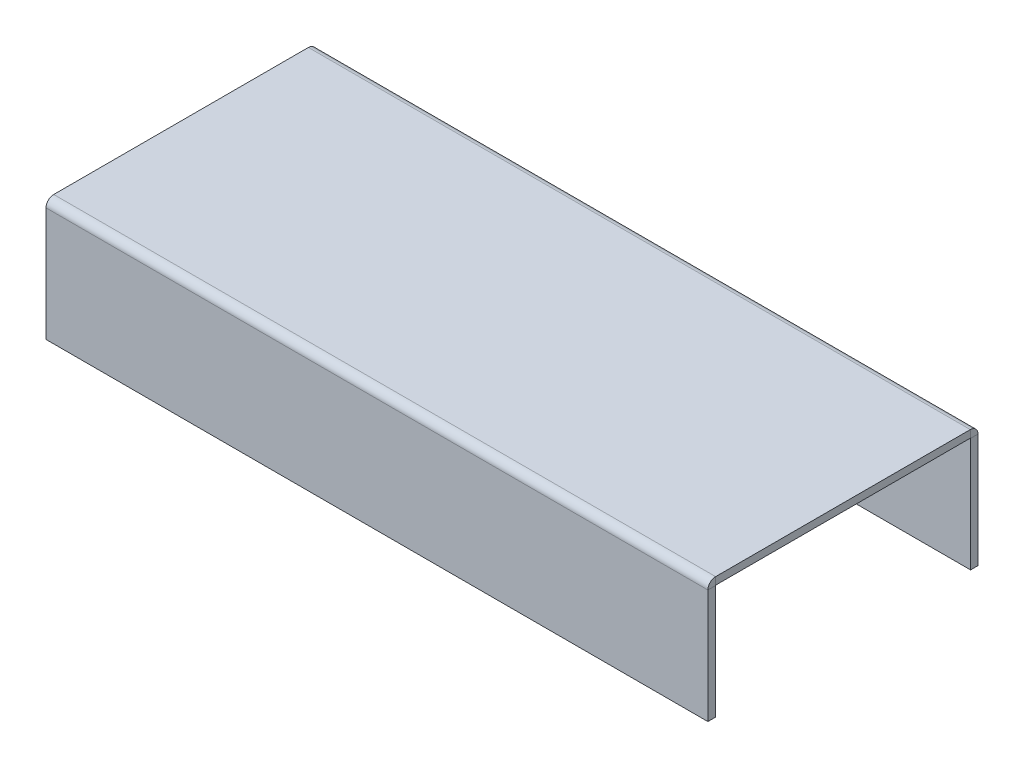
ISO-10303-21;
HEADER;
FILE_DESCRIPTION(('STEP AP214'),'2;1');
FILE_NAME('part.step','',(''),(''),'','','');
FILE_SCHEMA(('AUTOMOTIVE_DESIGN { 1 0 10303 214 1 1 1 1 }'));
ENDSEC;
DATA;
#1=APPLICATION_CONTEXT('core data for automotive mechanical design processes');
#2=APPLICATION_PROTOCOL_DEFINITION('international standard','automotive_design',2000,#1);
#3=PRODUCT_CONTEXT('',#1,'mechanical');
#4=PRODUCT('Part','Part','',(#3));
#5=PRODUCT_RELATED_PRODUCT_CATEGORY('part','',(#4));
#6=PRODUCT_DEFINITION_FORMATION('','',#4);
#7=PRODUCT_DEFINITION_CONTEXT('part definition',#1,'design');
#8=PRODUCT_DEFINITION('design','',#6,#7);
#9=PRODUCT_DEFINITION_SHAPE('','',#8);
#10=(LENGTH_UNIT() NAMED_UNIT(*) SI_UNIT(.MILLI.,.METRE.));
#11=(NAMED_UNIT(*) PLANE_ANGLE_UNIT() SI_UNIT($,.RADIAN.));
#12=(NAMED_UNIT(*) SI_UNIT($,.STERADIAN.) SOLID_ANGLE_UNIT());
#13=UNCERTAINTY_MEASURE_WITH_UNIT(LENGTH_MEASURE(1.E-05),#10,'distance_accuracy_value','');
#14=(GEOMETRIC_REPRESENTATION_CONTEXT(3) GLOBAL_UNCERTAINTY_ASSIGNED_CONTEXT((#13)) GLOBAL_UNIT_ASSIGNED_CONTEXT((#10,
#11,#12)) REPRESENTATION_CONTEXT('',''));
#15=CARTESIAN_POINT('',(0.,0.,0.));
#16=DIRECTION('',(0.,0.,1.));
#17=DIRECTION('',(1.,0.,0.));
#18=AXIS2_PLACEMENT_3D('',#15,#16,#17);
#19=CARTESIAN_POINT('',(-0.123044413465666,2.5,-26.1266618448792));
#20=DIRECTION('',(1.,0.,0.));
#21=DIRECTION('',(0.,0.,-1.));
#22=AXIS2_PLACEMENT_3D('',#19,#20,#21);
#23=PLANE('',#22);
#24=DIRECTION('',(0.,1.,0.));
#25=VECTOR('',#24,1.);
#26=CARTESIAN_POINT('',(-0.123044413465667,0.,-26.0266618448792));
#27=LINE('',#26,#25);
#28=CARTESIAN_POINT('',(-0.123044413465667,0.,-26.0266618448792));
#29=VERTEX_POINT('',#28);
#30=CARTESIAN_POINT('',(-0.123044413465666,2.5,-26.0266618448792));
#31=VERTEX_POINT('',#30);
#32=EDGE_CURVE('E179',#29,#31,#27,.T.);
#33=ORIENTED_EDGE('',*,*,#32,.F.);
#34=DIRECTION('',(0.,0.,1.));
#35=VECTOR('',#34,1.);
#36=CARTESIAN_POINT('',(-0.123044413465666,0.,-26.1266618448792));
#37=LINE('',#36,#35);
#38=CARTESIAN_POINT('',(-0.123044413465667,0.,59.7733386091857));
#39=VERTEX_POINT('',#38);
#40=EDGE_CURVE('E232',#29,#39,#37,.T.);
#41=ORIENTED_EDGE('',*,*,#40,.T.);
#42=DIRECTION('',(0.,1.,0.));
#43=VECTOR('',#42,1.);
#44=CARTESIAN_POINT('',(-0.123044413465667,0.,59.7733386091857));
#45=LINE('',#44,#43);
#46=CARTESIAN_POINT('',(-0.123044413465667,2.5,59.7733386091857));
#47=VERTEX_POINT('',#46);
#48=EDGE_CURVE('E220',#39,#47,#45,.T.);
#49=ORIENTED_EDGE('',*,*,#48,.T.);
#50=DIRECTION('',(0.,0.,1.));
#51=VECTOR('',#50,1.);
#52=CARTESIAN_POINT('',(-0.123044413465666,2.5,-26.1266618448792));
#53=LINE('',#52,#51);
#54=EDGE_CURVE('E41',#31,#47,#53,.T.);
#55=ORIENTED_EDGE('',*,*,#54,.F.);
#56=EDGE_LOOP('',(#33,#41,#49,#55));
#57=FACE_BOUND('',#56,.T.);
#58=ADVANCED_FACE('F33',(#57),#23,.F.);
#59=CARTESIAN_POINT('',(222.876954908644,2.5,-26.1266618448792));
#60=DIRECTION('',(-1.,0.,0.));
#61=DIRECTION('',(0.,0.,1.));
#62=AXIS2_PLACEMENT_3D('',#59,#60,#61);
#63=PLANE('',#62);
#64=DIRECTION('',(0.,1.,0.));
#65=VECTOR('',#64,1.);
#66=CARTESIAN_POINT('',(222.876954908644,0.,-26.0266618448792));
#67=LINE('',#66,#65);
#68=CARTESIAN_POINT('',(222.876954908644,0.,-26.0266618448792));
#69=VERTEX_POINT('',#68);
#70=CARTESIAN_POINT('',(222.876954908644,2.5,-26.0266618448792));
#71=VERTEX_POINT('',#70);
#72=EDGE_CURVE('E172',#69,#71,#67,.T.);
#73=ORIENTED_EDGE('',*,*,#72,.T.);
#74=DIRECTION('',(0.,0.,-1.));
#75=VECTOR('',#74,1.);
#76=CARTESIAN_POINT('',(222.876954908644,2.5,-26.1266618448792));
#77=LINE('',#76,#75);
#78=CARTESIAN_POINT('',(222.876954908644,2.5,59.7733386091857));
#79=VERTEX_POINT('',#78);
#80=EDGE_CURVE('E11',#79,#71,#77,.T.);
#81=ORIENTED_EDGE('',*,*,#80,.F.);
#82=DIRECTION('',(0.,1.,0.));
#83=VECTOR('',#82,1.);
#84=CARTESIAN_POINT('',(222.876954908644,0.,59.7733386091857));
#85=LINE('',#84,#83);
#86=CARTESIAN_POINT('',(222.876954908644,0.,59.7733386091857));
#87=VERTEX_POINT('',#86);
#88=EDGE_CURVE('E230',#87,#79,#85,.T.);
#89=ORIENTED_EDGE('',*,*,#88,.F.);
#90=DIRECTION('',(0.,0.,-1.));
#91=VECTOR('',#90,1.);
#92=CARTESIAN_POINT('',(222.876954908644,0.,-26.1266618448792));
#93=LINE('',#92,#91);
#94=EDGE_CURVE('E36',#87,#69,#93,.T.);
#95=ORIENTED_EDGE('',*,*,#94,.T.);
#96=EDGE_LOOP('',(#73,#81,#89,#95));
#97=FACE_BOUND('',#96,.T.);
#98=ADVANCED_FACE('F245',(#97),#63,.F.);
#99=CARTESIAN_POINT('',(-0.123044413465656,2.5,59.8733386091857));
#100=DIRECTION('',(0.,1.,0.));
#101=DIRECTION('',(0.,0.,1.));
#102=AXIS2_PLACEMENT_3D('',#99,#100,#101);
#103=PLANE('',#102);
#104=ORIENTED_EDGE('',*,*,#80,.T.);
#105=DIRECTION('',(1.,0.,0.));
#106=VECTOR('',#105,1.);
#107=CARTESIAN_POINT('',(222.876954908644,2.5,-26.0266618448792));
#108=LINE('',#107,#106);
#109=EDGE_CURVE('E127',#71,#31,#108,.F.);
#110=ORIENTED_EDGE('',*,*,#109,.T.);
#111=ORIENTED_EDGE('',*,*,#54,.T.);
#112=DIRECTION('',(-1.,0.,0.));
#113=VECTOR('',#112,1.);
#114=CARTESIAN_POINT('',(-0.123044413465667,2.5,59.7733386091857));
#115=LINE('',#114,#113);
#116=EDGE_CURVE('E215',#47,#79,#115,.F.);
#117=ORIENTED_EDGE('',*,*,#116,.T.);
#118=EDGE_LOOP('',(#104,#110,#111,#117));
#119=FACE_BOUND('',#118,.T.);
#120=ADVANCED_FACE('F282',(#119),#103,.T.);
#121=CARTESIAN_POINT('',(-0.123044413465656,0.,59.8733386091857));
#122=DIRECTION('',(0.,1.,0.));
#123=DIRECTION('',(0.,0.,1.));
#124=AXIS2_PLACEMENT_3D('',#121,#122,#123);
#125=PLANE('',#124);
#126=DIRECTION('',(1.,0.,0.));
#127=VECTOR('',#126,1.);
#128=CARTESIAN_POINT('',(222.876954908644,0.,-26.0266618448792));
#129=LINE('',#128,#127);
#130=EDGE_CURVE('E176',#69,#29,#129,.F.);
#131=ORIENTED_EDGE('',*,*,#130,.F.);
#132=ORIENTED_EDGE('',*,*,#94,.F.);
#133=DIRECTION('',(-1.,0.,0.));
#134=VECTOR('',#133,1.);
#135=CARTESIAN_POINT('',(-0.123044413465667,0.,59.7733386091857));
#136=LINE('',#135,#134);
#137=EDGE_CURVE('E226',#39,#87,#136,.F.);
#138=ORIENTED_EDGE('',*,*,#137,.F.);
#139=ORIENTED_EDGE('',*,*,#40,.F.);
#140=EDGE_LOOP('',(#131,#132,#138,#139));
#141=FACE_BOUND('',#140,.T.);
#142=ADVANCED_FACE('F249',(#141),#125,.F.);
#143=CARTESIAN_POINT('',(222.876954908644,-0.100000000000003,59.7733386091857));
#144=DIRECTION('',(1.,0.,0.));
#145=DIRECTION('',(0.,0.,-1.));
#146=AXIS2_PLACEMENT_3D('',#143,#144,#145);
#147=PLANE('',#146);
#148=DIRECTION('',(0.,0.,1.));
#149=VECTOR('',#148,1.);
#150=CARTESIAN_POINT('',(222.876954908644,-0.100000000000003,59.8733386091857));
#151=LINE('',#150,#149);
#152=CARTESIAN_POINT('',(222.876954908644,-0.100000000000003,59.8733386091857));
#153=VERTEX_POINT('',#152);
#154=CARTESIAN_POINT('',(222.876954908644,-0.099999999999994,62.3733386091857));
#155=VERTEX_POINT('',#154);
#156=EDGE_CURVE('E181',#153,#155,#151,.T.);
#157=ORIENTED_EDGE('',*,*,#156,.F.);
#158=CARTESIAN_POINT('',(222.876954908644,-0.100000000000003,59.7733386091857));
#159=DIRECTION('',(-1.,0.,0.));
#160=DIRECTION('',(0.,0.,1.));
#161=AXIS2_PLACEMENT_3D('',#158,#159,#160);
#162=CIRCLE('',#161,0.100000000000003);
#163=EDGE_CURVE('E223',#87,#153,#162,.F.);
#164=ORIENTED_EDGE('',*,*,#163,.F.);
#165=ORIENTED_EDGE('',*,*,#88,.T.);
#166=CARTESIAN_POINT('',(222.876954908644,-0.100000000000003,59.7733386091857));
#167=DIRECTION('',(-1.,0.,0.));
#168=DIRECTION('',(0.,0.,1.));
#169=AXIS2_PLACEMENT_3D('',#166,#167,#168);
#170=CIRCLE('',#169,2.6);
#171=EDGE_CURVE('E57',#79,#155,#170,.F.);
#172=ORIENTED_EDGE('',*,*,#171,.T.);
#173=EDGE_LOOP('',(#157,#164,#165,#172));
#174=FACE_BOUND('',#173,.T.);
#175=ADVANCED_FACE('F307',(#174),#147,.T.);
#176=CARTESIAN_POINT('',(-0.123044413465667,-0.100000000000003,59.7733386091857));
#177=DIRECTION('',(1.,0.,0.));
#178=DIRECTION('',(0.,0.,-1.));
#179=AXIS2_PLACEMENT_3D('',#176,#177,#178);
#180=PLANE('',#179);
#181=CARTESIAN_POINT('',(-0.123044413465667,-0.100000000000003,59.7733386091857));
#182=DIRECTION('',(-1.,0.,0.));
#183=DIRECTION('',(0.,0.,1.));
#184=AXIS2_PLACEMENT_3D('',#181,#182,#183);
#185=CIRCLE('',#184,0.100000000000003);
#186=CARTESIAN_POINT('',(-0.123044413465667,-0.100000000000003,59.8733386091857));
#187=VERTEX_POINT('',#186);
#188=EDGE_CURVE('E212',#187,#39,#185,.T.);
#189=ORIENTED_EDGE('',*,*,#188,.F.);
#190=DIRECTION('',(0.,0.,1.));
#191=VECTOR('',#190,1.);
#192=CARTESIAN_POINT('',(-0.123044413465667,-0.100000000000003,59.8733386091857));
#193=LINE('',#192,#191);
#194=CARTESIAN_POINT('',(-0.123044413465656,-0.100000000000003,62.3733386091857));
#195=VERTEX_POINT('',#194);
#196=EDGE_CURVE('E185',#187,#195,#193,.T.);
#197=ORIENTED_EDGE('',*,*,#196,.T.);
#198=CARTESIAN_POINT('',(-0.123044413465667,-0.100000000000003,59.7733386091857));
#199=DIRECTION('',(-1.,0.,0.));
#200=DIRECTION('',(0.,0.,1.));
#201=AXIS2_PLACEMENT_3D('',#198,#199,#200);
#202=CIRCLE('',#201,2.6);
#203=EDGE_CURVE('E218',#195,#47,#202,.T.);
#204=ORIENTED_EDGE('',*,*,#203,.T.);
#205=ORIENTED_EDGE('',*,*,#48,.F.);
#206=EDGE_LOOP('',(#189,#197,#204,#205));
#207=FACE_BOUND('',#206,.T.);
#208=ADVANCED_FACE('F288',(#207),#180,.F.);
#209=CARTESIAN_POINT('',(-0.123044413465667,-0.100000000000003,59.7733386091857));
#210=DIRECTION('',(-1.,0.,0.));
#211=DIRECTION('',(0.,0.,1.));
#212=AXIS2_PLACEMENT_3D('',#209,#210,#211);
#213=CYLINDRICAL_SURFACE('',#212,2.6);
#214=ORIENTED_EDGE('',*,*,#116,.F.);
#215=ORIENTED_EDGE('',*,*,#203,.F.);
#216=DIRECTION('',(-1.,0.,0.));
#217=VECTOR('',#216,1.);
#218=CARTESIAN_POINT('',(-0.123044413465656,-0.100000000000003,62.3733386091857));
#219=LINE('',#218,#217);
#220=EDGE_CURVE('E188',#155,#195,#219,.T.);
#221=ORIENTED_EDGE('',*,*,#220,.F.);
#222=ORIENTED_EDGE('',*,*,#171,.F.);
#223=EDGE_LOOP('',(#214,#215,#221,#222));
#224=FACE_BOUND('',#223,.T.);
#225=ADVANCED_FACE('F285',(#224),#213,.T.);
#226=CARTESIAN_POINT('',(-0.123044413465667,-0.100000000000003,59.7733386091857));
#227=DIRECTION('',(-1.,0.,0.));
#228=DIRECTION('',(0.,0.,1.));
#229=AXIS2_PLACEMENT_3D('',#226,#227,#228);
#230=CYLINDRICAL_SURFACE('',#229,0.100000000000003);
#231=ORIENTED_EDGE('',*,*,#137,.T.);
#232=ORIENTED_EDGE('',*,*,#163,.T.);
#233=DIRECTION('',(-1.,0.,0.));
#234=VECTOR('',#233,1.);
#235=CARTESIAN_POINT('',(222.876954908644,-0.100000000000003,59.8733386091857));
#236=LINE('',#235,#234);
#237=EDGE_CURVE('E183',#153,#187,#236,.T.);
#238=ORIENTED_EDGE('',*,*,#237,.T.);
#239=ORIENTED_EDGE('',*,*,#188,.T.);
#240=EDGE_LOOP('',(#231,#232,#238,#239));
#241=FACE_BOUND('',#240,.T.);
#242=ADVANCED_FACE('F310',(#241),#230,.F.);
#243=CARTESIAN_POINT('',(-0.123044413465656,0.,62.3733386091857));
#244=DIRECTION('',(-1.,0.,0.));
#245=DIRECTION('',(0.,0.,1.));
#246=AXIS2_PLACEMENT_3D('',#243,#244,#245);
#247=PLANE('',#246);
#248=DIRECTION('',(0.,1.,0.));
#249=VECTOR('',#248,1.);
#250=CARTESIAN_POINT('',(-0.123044413465656,0.,62.3733386091857));
#251=LINE('',#250,#249);
#252=CARTESIAN_POINT('',(-0.123044413465656,-38.5,62.3733386091859));
#253=VERTEX_POINT('',#252);
#254=EDGE_CURVE('E200',#253,#195,#251,.T.);
#255=ORIENTED_EDGE('',*,*,#254,.T.);
#256=ORIENTED_EDGE('',*,*,#196,.F.);
#257=DIRECTION('',(0.,1.,0.));
#258=VECTOR('',#257,1.);
#259=CARTESIAN_POINT('',(-0.123044413465656,0.,59.8733386091857));
#260=LINE('',#259,#258);
#261=CARTESIAN_POINT('',(-0.123044413465656,-38.5,59.8733386091859));
#262=VERTEX_POINT('',#261);
#263=EDGE_CURVE('E197',#262,#187,#260,.T.);
#264=ORIENTED_EDGE('',*,*,#263,.F.);
#265=DIRECTION('',(0.,0.,-1.));
#266=VECTOR('',#265,1.);
#267=CARTESIAN_POINT('',(-0.123044413465656,-38.5,62.3733386091859));
#268=LINE('',#267,#266);
#269=EDGE_CURVE('E210',#253,#262,#268,.T.);
#270=ORIENTED_EDGE('',*,*,#269,.F.);
#271=EDGE_LOOP('',(#255,#256,#264,#270));
#272=FACE_BOUND('',#271,.T.);
#273=ADVANCED_FACE('F297',(#272),#247,.T.);
#274=CARTESIAN_POINT('',(222.876954908644,-38.5,62.3733386091859));
#275=DIRECTION('',(1.,0.,0.));
#276=DIRECTION('',(0.,0.,-1.));
#277=AXIS2_PLACEMENT_3D('',#274,#275,#276);
#278=PLANE('',#277);
#279=DIRECTION('',(0.,-1.,0.));
#280=VECTOR('',#279,1.);
#281=CARTESIAN_POINT('',(222.876954908644,-38.5,59.8733386091859));
#282=LINE('',#281,#280);
#283=CARTESIAN_POINT('',(222.876954908644,-38.5,59.8733386091859));
#284=VERTEX_POINT('',#283);
#285=EDGE_CURVE('E193',#153,#284,#282,.T.);
#286=ORIENTED_EDGE('',*,*,#285,.F.);
#287=ORIENTED_EDGE('',*,*,#156,.T.);
#288=DIRECTION('',(0.,-1.,0.));
#289=VECTOR('',#288,1.);
#290=CARTESIAN_POINT('',(222.876954908644,-38.5,62.3733386091859));
#291=LINE('',#290,#289);
#292=CARTESIAN_POINT('',(222.876954908644,-38.5,62.3733386091859));
#293=VERTEX_POINT('',#292);
#294=EDGE_CURVE('E194',#155,#293,#291,.T.);
#295=ORIENTED_EDGE('',*,*,#294,.T.);
#296=DIRECTION('',(0.,0.,-1.));
#297=VECTOR('',#296,1.);
#298=CARTESIAN_POINT('',(222.876954908644,-38.5,62.3733386091859));
#299=LINE('',#298,#297);
#300=EDGE_CURVE('E203',#293,#284,#299,.T.);
#301=ORIENTED_EDGE('',*,*,#300,.T.);
#302=EDGE_LOOP('',(#286,#287,#295,#301));
#303=FACE_BOUND('',#302,.T.);
#304=ADVANCED_FACE('F304',(#303),#278,.T.);
#305=CARTESIAN_POINT('',(-0.123044413465656,0.,62.3733386091857));
#306=DIRECTION('',(0.,0.,1.));
#307=DIRECTION('',(0.,-1.,0.));
#308=AXIS2_PLACEMENT_3D('',#305,#306,#307);
#309=PLANE('',#308);
#310=ORIENTED_EDGE('',*,*,#294,.F.);
#311=ORIENTED_EDGE('',*,*,#220,.T.);
#312=ORIENTED_EDGE('',*,*,#254,.F.);
#313=DIRECTION('',(-1.,0.,0.));
#314=VECTOR('',#313,1.);
#315=CARTESIAN_POINT('',(-0.123044413465656,-38.5,62.3733386091859));
#316=LINE('',#315,#314);
#317=EDGE_CURVE('E196',#293,#253,#316,.T.);
#318=ORIENTED_EDGE('',*,*,#317,.F.);
#319=EDGE_LOOP('',(#310,#311,#312,#318));
#320=FACE_BOUND('',#319,.T.);
#321=ADVANCED_FACE('F295',(#320),#309,.T.);
#322=CARTESIAN_POINT('',(-0.123044413465656,0.,59.8733386091857));
#323=DIRECTION('',(0.,0.,1.));
#324=DIRECTION('',(0.,-1.,0.));
#325=AXIS2_PLACEMENT_3D('',#322,#323,#324);
#326=PLANE('',#325);
#327=ORIENTED_EDGE('',*,*,#237,.F.);
#328=ORIENTED_EDGE('',*,*,#285,.T.);
#329=DIRECTION('',(-1.,0.,0.));
#330=VECTOR('',#329,1.);
#331=CARTESIAN_POINT('',(-0.123044413465656,-38.5,59.8733386091859));
#332=LINE('',#331,#330);
#333=EDGE_CURVE('E205',#284,#262,#332,.T.);
#334=ORIENTED_EDGE('',*,*,#333,.T.);
#335=ORIENTED_EDGE('',*,*,#263,.T.);
#336=EDGE_LOOP('',(#327,#328,#334,#335));
#337=FACE_BOUND('',#336,.T.);
#338=ADVANCED_FACE('F312',(#337),#326,.F.);
#339=CARTESIAN_POINT('',(-0.123044413465656,-38.5,62.3733386091859));
#340=DIRECTION('',(0.,-1.,0.));
#341=DIRECTION('',(0.,0.,-1.));
#342=AXIS2_PLACEMENT_3D('',#339,#340,#341);
#343=PLANE('',#342);
#344=ORIENTED_EDGE('',*,*,#333,.F.);
#345=ORIENTED_EDGE('',*,*,#300,.F.);
#346=ORIENTED_EDGE('',*,*,#317,.T.);
#347=ORIENTED_EDGE('',*,*,#269,.T.);
#348=EDGE_LOOP('',(#344,#345,#346,#347));
#349=FACE_BOUND('',#348,.T.);
#350=ADVANCED_FACE('F301',(#349),#343,.T.);
#351=CARTESIAN_POINT('',(-0.123044413465667,-0.1,-26.0266618448792));
#352=DIRECTION('',(-1.,0.,0.));
#353=DIRECTION('',(0.,0.,1.));
#354=AXIS2_PLACEMENT_3D('',#351,#352,#353);
#355=PLANE('',#354);
#356=DIRECTION('',(0.,0.,-1.));
#357=VECTOR('',#356,1.);
#358=CARTESIAN_POINT('',(-0.123044413465666,-0.0999999999999994,-26.1266618448792));
#359=LINE('',#358,#357);
#360=CARTESIAN_POINT('',(-0.123044413465667,-0.0999999999999997,-26.1266618448792));
#361=VERTEX_POINT('',#360);
#362=CARTESIAN_POINT('',(-0.123044413465667,-0.0999999999999909,-28.6266618448792));
#363=VERTEX_POINT('',#362);
#364=EDGE_CURVE('E257',#361,#363,#359,.T.);
#365=ORIENTED_EDGE('',*,*,#364,.F.);
#366=CARTESIAN_POINT('',(-0.123044413465667,-0.1,-26.0266618448792));
#367=DIRECTION('',(1.,0.,0.));
#368=DIRECTION('',(0.,0.,-1.));
#369=AXIS2_PLACEMENT_3D('',#366,#367,#368);
#370=CIRCLE('',#369,0.0999999999999994);
#371=EDGE_CURVE('E130',#29,#361,#370,.F.);
#372=ORIENTED_EDGE('',*,*,#371,.F.);
#373=ORIENTED_EDGE('',*,*,#32,.T.);
#374=CARTESIAN_POINT('',(-0.123044413465667,-0.1,-26.0266618448792));
#375=DIRECTION('',(1.,0.,0.));
#376=DIRECTION('',(0.,0.,-1.));
#377=AXIS2_PLACEMENT_3D('',#374,#375,#376);
#378=CIRCLE('',#377,2.6);
#379=EDGE_CURVE('E49',#31,#363,#378,.F.);
#380=ORIENTED_EDGE('',*,*,#379,.T.);
#381=EDGE_LOOP('',(#365,#372,#373,#380));
#382=FACE_BOUND('',#381,.T.);
#383=ADVANCED_FACE('F255',(#382),#355,.T.);
#384=CARTESIAN_POINT('',(222.876954908644,-0.1,-26.0266618448792));
#385=DIRECTION('',(-1.,0.,0.));
#386=DIRECTION('',(0.,0.,1.));
#387=AXIS2_PLACEMENT_3D('',#384,#385,#386);
#388=PLANE('',#387);
#389=CARTESIAN_POINT('',(222.876954908644,-0.1,-26.0266618448792));
#390=DIRECTION('',(1.,0.,0.));
#391=DIRECTION('',(0.,0.,-1.));
#392=AXIS2_PLACEMENT_3D('',#389,#390,#391);
#393=CIRCLE('',#392,0.0999999999999994);
#394=CARTESIAN_POINT('',(222.876954908644,-0.0999999999999997,-26.1266618448792));
#395=VERTEX_POINT('',#394);
#396=EDGE_CURVE('E137',#395,#69,#393,.T.);
#397=ORIENTED_EDGE('',*,*,#396,.F.);
#398=DIRECTION('',(0.,0.,-1.));
#399=VECTOR('',#398,1.);
#400=CARTESIAN_POINT('',(222.876954908644,-0.0999999999999994,-26.1266618448792));
#401=LINE('',#400,#399);
#402=CARTESIAN_POINT('',(222.876954908644,-0.0999999999999819,-28.6266618448792));
#403=VERTEX_POINT('',#402);
#404=EDGE_CURVE('E134',#395,#403,#401,.T.);
#405=ORIENTED_EDGE('',*,*,#404,.T.);
#406=CARTESIAN_POINT('',(222.876954908644,-0.1,-26.0266618448792));
#407=DIRECTION('',(1.,0.,0.));
#408=DIRECTION('',(0.,0.,-1.));
#409=AXIS2_PLACEMENT_3D('',#406,#407,#408);
#410=CIRCLE('',#409,2.6);
#411=EDGE_CURVE('E121',#403,#71,#410,.T.);
#412=ORIENTED_EDGE('',*,*,#411,.T.);
#413=ORIENTED_EDGE('',*,*,#72,.F.);
#414=EDGE_LOOP('',(#397,#405,#412,#413));
#415=FACE_BOUND('',#414,.T.);
#416=ADVANCED_FACE('F135',(#415),#388,.F.);
#417=CARTESIAN_POINT('',(222.876954908644,-0.1,-26.0266618448792));
#418=DIRECTION('',(1.,0.,0.));
#419=DIRECTION('',(0.,0.,-1.));
#420=AXIS2_PLACEMENT_3D('',#417,#418,#419);
#421=CYLINDRICAL_SURFACE('',#420,2.6);
#422=ORIENTED_EDGE('',*,*,#109,.F.);
#423=ORIENTED_EDGE('',*,*,#411,.F.);
#424=DIRECTION('',(-1.,0.,0.));
#425=VECTOR('',#424,1.);
#426=CARTESIAN_POINT('',(-0.123044413465666,-0.099999999999982,-28.6266618448792));
#427=LINE('',#426,#425);
#428=EDGE_CURVE('E125',#403,#363,#427,.T.);
#429=ORIENTED_EDGE('',*,*,#428,.T.);
#430=ORIENTED_EDGE('',*,*,#379,.F.);
#431=EDGE_LOOP('',(#422,#423,#429,#430));
#432=FACE_BOUND('',#431,.T.);
#433=ADVANCED_FACE('F123',(#432),#421,.T.);
#434=CARTESIAN_POINT('',(222.876954908644,-0.1,-26.0266618448792));
#435=DIRECTION('',(1.,0.,0.));
#436=DIRECTION('',(0.,0.,-1.));
#437=AXIS2_PLACEMENT_3D('',#434,#435,#436);
#438=CYLINDRICAL_SURFACE('',#437,0.0999999999999994);
#439=ORIENTED_EDGE('',*,*,#130,.T.);
#440=ORIENTED_EDGE('',*,*,#371,.T.);
#441=DIRECTION('',(1.,0.,0.));
#442=VECTOR('',#441,1.);
#443=CARTESIAN_POINT('',(-0.123044413465666,-0.0999999999999994,-26.1266618448792));
#444=LINE('',#443,#442);
#445=EDGE_CURVE('E142',#361,#395,#444,.T.);
#446=ORIENTED_EDGE('',*,*,#445,.T.);
#447=ORIENTED_EDGE('',*,*,#396,.T.);
#448=EDGE_LOOP('',(#439,#440,#446,#447));
#449=FACE_BOUND('',#448,.T.);
#450=ADVANCED_FACE('F252',(#449),#438,.F.);
#451=CARTESIAN_POINT('',(-0.123044413465666,0.,-28.6266618448792));
#452=DIRECTION('',(-1.,0.,0.));
#453=DIRECTION('',(0.,0.,1.));
#454=AXIS2_PLACEMENT_3D('',#451,#452,#453);
#455=PLANE('',#454);
#456=DIRECTION('',(0.,-1.,0.));
#457=VECTOR('',#456,1.);
#458=CARTESIAN_POINT('',(-0.123044413465666,0.,-26.1266618448792));
#459=LINE('',#458,#457);
#460=CARTESIAN_POINT('',(-0.123044413465666,-38.5,-26.1266618448794));
#461=VERTEX_POINT('',#460);
#462=EDGE_CURVE('E152',#361,#461,#459,.T.);
#463=ORIENTED_EDGE('',*,*,#462,.F.);
#464=ORIENTED_EDGE('',*,*,#364,.T.);
#465=DIRECTION('',(0.,-1.,0.));
#466=VECTOR('',#465,1.);
#467=CARTESIAN_POINT('',(-0.123044413465666,0.,-28.6266618448792));
#468=LINE('',#467,#466);
#469=CARTESIAN_POINT('',(-0.123044413465666,-38.5,-28.6266618448794));
#470=VERTEX_POINT('',#469);
#471=EDGE_CURVE('E151',#363,#470,#468,.T.);
#472=ORIENTED_EDGE('',*,*,#471,.T.);
#473=DIRECTION('',(0.,0.,1.));
#474=VECTOR('',#473,1.);
#475=CARTESIAN_POINT('',(-0.123044413465666,-38.5,-28.6266618448794));
#476=LINE('',#475,#474);
#477=EDGE_CURVE('E156',#470,#461,#476,.T.);
#478=ORIENTED_EDGE('',*,*,#477,.T.);
#479=EDGE_LOOP('',(#463,#464,#472,#478));
#480=FACE_BOUND('',#479,.T.);
#481=ADVANCED_FACE('F263',(#480),#455,.T.);
#482=CARTESIAN_POINT('',(222.876954908644,-38.5,-28.6266618448794));
#483=DIRECTION('',(1.,0.,0.));
#484=DIRECTION('',(0.,0.,-1.));
#485=AXIS2_PLACEMENT_3D('',#482,#483,#484);
#486=PLANE('',#485);
#487=DIRECTION('',(0.,1.,0.));
#488=VECTOR('',#487,1.);
#489=CARTESIAN_POINT('',(222.876954908644,-38.5,-28.6266618448794));
#490=LINE('',#489,#488);
#491=CARTESIAN_POINT('',(222.876954908644,-38.5,-28.6266618448794));
#492=VERTEX_POINT('',#491);
#493=EDGE_CURVE('E149',#492,#403,#490,.T.);
#494=ORIENTED_EDGE('',*,*,#493,.T.);
#495=ORIENTED_EDGE('',*,*,#404,.F.);
#496=DIRECTION('',(0.,1.,0.));
#497=VECTOR('',#496,1.);
#498=CARTESIAN_POINT('',(222.876954908644,-38.5,-26.1266618448794));
#499=LINE('',#498,#497);
#500=CARTESIAN_POINT('',(222.876954908644,-38.5,-26.1266618448794));
#501=VERTEX_POINT('',#500);
#502=EDGE_CURVE('E168',#501,#395,#499,.T.);
#503=ORIENTED_EDGE('',*,*,#502,.F.);
#504=DIRECTION('',(0.,0.,1.));
#505=VECTOR('',#504,1.);
#506=CARTESIAN_POINT('',(222.876954908644,-38.5,-28.6266618448794));
#507=LINE('',#506,#505);
#508=EDGE_CURVE('E155',#492,#501,#507,.T.);
#509=ORIENTED_EDGE('',*,*,#508,.F.);
#510=EDGE_LOOP('',(#494,#495,#503,#509));
#511=FACE_BOUND('',#510,.T.);
#512=ADVANCED_FACE('F154',(#511),#486,.T.);
#513=CARTESIAN_POINT('',(-0.123044413465666,-38.5,-28.6266618448794));
#514=DIRECTION('',(0.,0.,1.));
#515=DIRECTION('',(0.,-1.,0.));
#516=AXIS2_PLACEMENT_3D('',#513,#514,#515);
#517=PLANE('',#516);
#518=ORIENTED_EDGE('',*,*,#428,.F.);
#519=ORIENTED_EDGE('',*,*,#493,.F.);
#520=DIRECTION('',(1.,0.,0.));
#521=VECTOR('',#520,1.);
#522=CARTESIAN_POINT('',(-0.123044413465666,-38.5,-28.6266618448794));
#523=LINE('',#522,#521);
#524=EDGE_CURVE('E157',#470,#492,#523,.T.);
#525=ORIENTED_EDGE('',*,*,#524,.F.);
#526=ORIENTED_EDGE('',*,*,#471,.F.);
#527=EDGE_LOOP('',(#518,#519,#525,#526));
#528=FACE_BOUND('',#527,.T.);
#529=ADVANCED_FACE('F147',(#528),#517,.F.);
#530=CARTESIAN_POINT('',(-0.123044413465666,-38.5,-26.1266618448794));
#531=DIRECTION('',(0.,0.,1.));
#532=DIRECTION('',(0.,-1.,0.));
#533=AXIS2_PLACEMENT_3D('',#530,#531,#532);
#534=PLANE('',#533);
#535=ORIENTED_EDGE('',*,*,#502,.T.);
#536=ORIENTED_EDGE('',*,*,#445,.F.);
#537=ORIENTED_EDGE('',*,*,#462,.T.);
#538=DIRECTION('',(1.,0.,0.));
#539=VECTOR('',#538,1.);
#540=CARTESIAN_POINT('',(-0.123044413465666,-38.5,-26.1266618448794));
#541=LINE('',#540,#539);
#542=EDGE_CURVE('E165',#461,#501,#541,.T.);
#543=ORIENTED_EDGE('',*,*,#542,.T.);
#544=EDGE_LOOP('',(#535,#536,#537,#543));
#545=FACE_BOUND('',#544,.T.);
#546=ADVANCED_FACE('F268',(#545),#534,.T.);
#547=CARTESIAN_POINT('',(-0.123044413465666,-38.5,-28.6266618448794));
#548=DIRECTION('',(0.,-1.,0.));
#549=DIRECTION('',(0.,0.,-1.));
#550=AXIS2_PLACEMENT_3D('',#547,#548,#549);
#551=PLANE('',#550);
#552=ORIENTED_EDGE('',*,*,#542,.F.);
#553=ORIENTED_EDGE('',*,*,#477,.F.);
#554=ORIENTED_EDGE('',*,*,#524,.T.);
#555=ORIENTED_EDGE('',*,*,#508,.T.);
#556=EDGE_LOOP('',(#552,#553,#554,#555));
#557=FACE_BOUND('',#556,.T.);
#558=ADVANCED_FACE('F266',(#557),#551,.T.);
#559=CLOSED_SHELL('',(#58,#98,#120,#142,#175,#208,#225,#242,#273,#304,#321,#338,#350,#383,#416,
#433,#450,#481,#512,#529,#546,#558));
#560=MANIFOLD_SOLID_BREP('B2',#559);
#561=ADVANCED_BREP_SHAPE_REPRESENTATION('',(#18,#560),#14);
#562=SHAPE_DEFINITION_REPRESENTATION(#9,#561);
ENDSEC;
END-ISO-10303-21;
